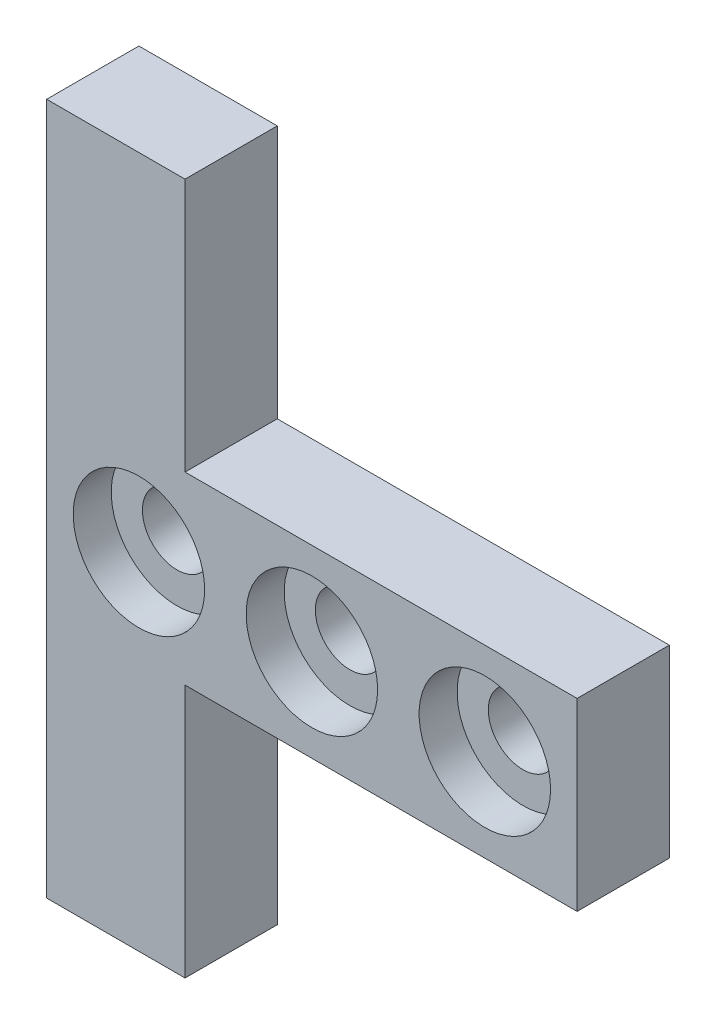
ISO-10303-21;
HEADER;
FILE_DESCRIPTION(('STEP AP214'),'2;1');
FILE_NAME('part.step','',(''),(''),'','','');
FILE_SCHEMA(('AUTOMOTIVE_DESIGN { 1 0 10303 214 1 1 1 1 }'));
ENDSEC;
DATA;
#1=APPLICATION_CONTEXT('core data for automotive mechanical design processes');
#2=APPLICATION_PROTOCOL_DEFINITION('international standard','automotive_design',2000,#1);
#3=PRODUCT_CONTEXT('',#1,'mechanical');
#4=PRODUCT('Part','Part','',(#3));
#5=PRODUCT_RELATED_PRODUCT_CATEGORY('part','',(#4));
#6=PRODUCT_DEFINITION_FORMATION('','',#4);
#7=PRODUCT_DEFINITION_CONTEXT('part definition',#1,'design');
#8=PRODUCT_DEFINITION('design','',#6,#7);
#9=PRODUCT_DEFINITION_SHAPE('','',#8);
#10=(LENGTH_UNIT() NAMED_UNIT(*) SI_UNIT(.MILLI.,.METRE.));
#11=(NAMED_UNIT(*) PLANE_ANGLE_UNIT() SI_UNIT($,.RADIAN.));
#12=(NAMED_UNIT(*) SI_UNIT($,.STERADIAN.) SOLID_ANGLE_UNIT());
#13=UNCERTAINTY_MEASURE_WITH_UNIT(LENGTH_MEASURE(1.E-05),#10,'distance_accuracy_value','');
#14=(GEOMETRIC_REPRESENTATION_CONTEXT(3) GLOBAL_UNCERTAINTY_ASSIGNED_CONTEXT((#13)) GLOBAL_UNIT_ASSIGNED_CONTEXT((#10,
#11,#12)) REPRESENTATION_CONTEXT('',''));
#15=CARTESIAN_POINT('',(0.,0.,0.));
#16=DIRECTION('',(0.,0.,1.));
#17=DIRECTION('',(1.,0.,0.));
#18=AXIS2_PLACEMENT_3D('',#15,#16,#17);
#19=CARTESIAN_POINT('',(49.9972172088586,-189.705431529691,4.));
#20=DIRECTION('',(0.,0.,-1.));
#21=DIRECTION('',(-1.,0.,0.));
#22=AXIS2_PLACEMENT_3D('',#19,#20,#21);
#23=CYLINDRICAL_SURFACE('',#22,1.5);
#24=CARTESIAN_POINT('',(49.9972172088586,-189.705431529691,0.));
#25=DIRECTION('',(0.,0.,1.));
#26=DIRECTION('',(1.,0.,0.));
#27=AXIS2_PLACEMENT_3D('',#24,#25,#26);
#28=CIRCLE('',#27,1.5);
#29=CARTESIAN_POINT('',(51.4972172088586,-189.705431529691,0.));
#30=VERTEX_POINT('',#29);
#31=EDGE_CURVE('E150',#30,#30,#28,.T.);
#32=ORIENTED_EDGE('',*,*,#31,.F.);
#33=EDGE_LOOP('',(#32));
#34=FACE_BOUND('',#33,.T.);
#35=CARTESIAN_POINT('',(49.9972172088586,-189.705431529691,2.35));
#36=DIRECTION('',(0.,0.,1.));
#37=DIRECTION('',(1.,0.,0.));
#38=AXIS2_PLACEMENT_3D('',#35,#36,#37);
#39=CIRCLE('',#38,1.5);
#40=CARTESIAN_POINT('',(51.4972172088586,-189.705431529691,2.35));
#41=VERTEX_POINT('',#40);
#42=EDGE_CURVE('E39',#41,#41,#39,.T.);
#43=ORIENTED_EDGE('',*,*,#42,.T.);
#44=EDGE_LOOP('',(#43));
#45=FACE_BOUND('',#44,.T.);
#46=ADVANCED_FACE('F35',(#34,#45),#23,.F.);
#47=CARTESIAN_POINT('',(42.4972172088586,-189.705431529691,4.));
#48=DIRECTION('',(0.,0.,-1.));
#49=DIRECTION('',(-1.,0.,0.));
#50=AXIS2_PLACEMENT_3D('',#47,#48,#49);
#51=CYLINDRICAL_SURFACE('',#50,1.5);
#52=CARTESIAN_POINT('',(42.4972172088586,-189.705431529691,0.));
#53=DIRECTION('',(0.,0.,1.));
#54=DIRECTION('',(1.,0.,0.));
#55=AXIS2_PLACEMENT_3D('',#52,#53,#54);
#56=CIRCLE('',#55,1.5);
#57=CARTESIAN_POINT('',(43.9972172088586,-189.705431529691,0.));
#58=VERTEX_POINT('',#57);
#59=EDGE_CURVE('E147',#58,#58,#56,.T.);
#60=ORIENTED_EDGE('',*,*,#59,.F.);
#61=EDGE_LOOP('',(#60));
#62=FACE_BOUND('',#61,.T.);
#63=CARTESIAN_POINT('',(42.4972172088586,-189.705431529691,2.35));
#64=DIRECTION('',(0.,0.,1.));
#65=DIRECTION('',(1.,0.,0.));
#66=AXIS2_PLACEMENT_3D('',#63,#64,#65);
#67=CIRCLE('',#66,1.5);
#68=CARTESIAN_POINT('',(43.9972172088586,-189.705431529691,2.35));
#69=VERTEX_POINT('',#68);
#70=EDGE_CURVE('E164',#69,#69,#67,.T.);
#71=ORIENTED_EDGE('',*,*,#70,.T.);
#72=EDGE_LOOP('',(#71));
#73=FACE_BOUND('',#72,.T.);
#74=ADVANCED_FACE('F256',(#62,#73),#51,.F.);
#75=CARTESIAN_POINT('',(57.4972172088586,-189.705431529691,4.));
#76=DIRECTION('',(0.,0.,-1.));
#77=DIRECTION('',(-1.,0.,0.));
#78=AXIS2_PLACEMENT_3D('',#75,#76,#77);
#79=CYLINDRICAL_SURFACE('',#78,1.5);
#80=CARTESIAN_POINT('',(57.4972172088586,-189.705431529691,0.));
#81=DIRECTION('',(0.,0.,1.));
#82=DIRECTION('',(1.,0.,0.));
#83=AXIS2_PLACEMENT_3D('',#80,#81,#82);
#84=CIRCLE('',#83,1.5);
#85=CARTESIAN_POINT('',(58.9972172088586,-189.705431529691,0.));
#86=VERTEX_POINT('',#85);
#87=EDGE_CURVE('E153',#86,#86,#84,.T.);
#88=ORIENTED_EDGE('',*,*,#87,.F.);
#89=EDGE_LOOP('',(#88));
#90=FACE_BOUND('',#89,.T.);
#91=CARTESIAN_POINT('',(57.4972172088586,-189.705431529691,2.35));
#92=DIRECTION('',(0.,0.,1.));
#93=DIRECTION('',(1.,0.,0.));
#94=AXIS2_PLACEMENT_3D('',#91,#92,#93);
#95=CIRCLE('',#94,1.5);
#96=CARTESIAN_POINT('',(58.9972172088586,-189.705431529691,2.35));
#97=VERTEX_POINT('',#96);
#98=EDGE_CURVE('E162',#97,#97,#95,.T.);
#99=ORIENTED_EDGE('',*,*,#98,.T.);
#100=EDGE_LOOP('',(#99));
#101=FACE_BOUND('',#100,.T.);
#102=ADVANCED_FACE('F262',(#90,#101),#79,.F.);
#103=CARTESIAN_POINT('',(3.43624076470357E-13,-185.705431529692,4.));
#104=DIRECTION('',(0.,1.,0.));
#105=DIRECTION('',(-1.,0.,0.));
#106=AXIS2_PLACEMENT_3D('',#103,#104,#105);
#107=PLANE('',#106);
#108=DIRECTION('',(1.,0.,0.));
#109=VECTOR('',#108,1.);
#110=CARTESIAN_POINT('',(3.43624076470357E-13,-185.705431529692,0.));
#111=LINE('',#110,#109);
#112=CARTESIAN_POINT('',(44.4972172088586,-185.705431529692,0.));
#113=VERTEX_POINT('',#112);
#114=CARTESIAN_POINT('',(61.4972172088586,-185.705431529691,0.));
#115=VERTEX_POINT('',#114);
#116=EDGE_CURVE('E52',#113,#115,#111,.T.);
#117=ORIENTED_EDGE('',*,*,#116,.F.);
#118=DIRECTION('',(0.,0.,-1.));
#119=VECTOR('',#118,1.);
#120=CARTESIAN_POINT('',(44.4972172088586,-185.705431529692,4.));
#121=LINE('',#120,#119);
#122=CARTESIAN_POINT('',(44.4972172088586,-185.705431529692,4.));
#123=VERTEX_POINT('',#122);
#124=EDGE_CURVE('E220',#123,#113,#121,.T.);
#125=ORIENTED_EDGE('',*,*,#124,.F.);
#126=DIRECTION('',(1.,0.,0.));
#127=VECTOR('',#126,1.);
#128=CARTESIAN_POINT('',(3.43624076470357E-13,-185.705431529692,4.));
#129=LINE('',#128,#127);
#130=CARTESIAN_POINT('',(61.4972172088586,-185.705431529691,4.));
#131=VERTEX_POINT('',#130);
#132=EDGE_CURVE('E156',#123,#131,#129,.T.);
#133=ORIENTED_EDGE('',*,*,#132,.T.);
#134=DIRECTION('',(0.,0.,-1.));
#135=VECTOR('',#134,1.);
#136=CARTESIAN_POINT('',(61.4972172088586,-185.705431529691,4.));
#137=LINE('',#136,#135);
#138=EDGE_CURVE('E134',#131,#115,#137,.T.);
#139=ORIENTED_EDGE('',*,*,#138,.T.);
#140=EDGE_LOOP('',(#117,#125,#133,#139));
#141=FACE_BOUND('',#140,.T.);
#142=ADVANCED_FACE('F37',(#141),#107,.T.);
#143=CARTESIAN_POINT('',(0.,-174.705431529691,4.));
#144=DIRECTION('',(0.,-1.,0.));
#145=DIRECTION('',(0.,0.,-1.));
#146=AXIS2_PLACEMENT_3D('',#143,#144,#145);
#147=PLANE('',#146);
#148=DIRECTION('',(-1.,0.,0.));
#149=VECTOR('',#148,1.);
#150=CARTESIAN_POINT('',(0.,-174.705431529691,4.));
#151=LINE('',#150,#149);
#152=CARTESIAN_POINT('',(44.4972172088586,-174.705431529691,4.));
#153=VERTEX_POINT('',#152);
#154=CARTESIAN_POINT('',(38.4972172088586,-174.705431529691,4.));
#155=VERTEX_POINT('',#154);
#156=EDGE_CURVE('E129',#153,#155,#151,.T.);
#157=ORIENTED_EDGE('',*,*,#156,.F.);
#158=DIRECTION('',(0.,0.,1.));
#159=VECTOR('',#158,1.);
#160=CARTESIAN_POINT('',(44.4972172088586,-174.705431529691,4.));
#161=LINE('',#160,#159);
#162=CARTESIAN_POINT('',(44.4972172088586,-174.705431529691,0.));
#163=VERTEX_POINT('',#162);
#164=EDGE_CURVE('E109',#163,#153,#161,.T.);
#165=ORIENTED_EDGE('',*,*,#164,.F.);
#166=DIRECTION('',(-1.,0.,0.));
#167=VECTOR('',#166,1.);
#168=CARTESIAN_POINT('',(0.,-174.705431529691,0.));
#169=LINE('',#168,#167);
#170=CARTESIAN_POINT('',(38.4972172088586,-174.705431529691,0.));
#171=VERTEX_POINT('',#170);
#172=EDGE_CURVE('E136',#163,#171,#169,.T.);
#173=ORIENTED_EDGE('',*,*,#172,.T.);
#174=DIRECTION('',(0.,0.,-1.));
#175=VECTOR('',#174,1.);
#176=CARTESIAN_POINT('',(38.4972172088586,-174.705431529691,4.));
#177=LINE('',#176,#175);
#178=EDGE_CURVE('E11',#155,#171,#177,.T.);
#179=ORIENTED_EDGE('',*,*,#178,.F.);
#180=EDGE_LOOP('',(#157,#165,#173,#179));
#181=FACE_BOUND('',#180,.T.);
#182=ADVANCED_FACE('F206',(#181),#147,.F.);
#183=CARTESIAN_POINT('',(38.4972172088584,0.,4.));
#184=DIRECTION('',(1.,0.,0.));
#185=DIRECTION('',(0.,1.,0.));
#186=AXIS2_PLACEMENT_3D('',#183,#184,#185);
#187=PLANE('',#186);
#188=DIRECTION('',(0.,-1.,0.));
#189=VECTOR('',#188,1.);
#190=CARTESIAN_POINT('',(38.4972172088584,0.,0.));
#191=LINE('',#190,#189);
#192=CARTESIAN_POINT('',(38.4972172088586,-204.705431529692,0.));
#193=VERTEX_POINT('',#192);
#194=EDGE_CURVE('E138',#171,#193,#191,.T.);
#195=ORIENTED_EDGE('',*,*,#194,.T.);
#196=DIRECTION('',(0.,0.,-1.));
#197=VECTOR('',#196,1.);
#198=CARTESIAN_POINT('',(38.4972172088586,-204.705431529692,4.));
#199=LINE('',#198,#197);
#200=CARTESIAN_POINT('',(38.4972172088586,-204.705431529692,4.));
#201=VERTEX_POINT('',#200);
#202=EDGE_CURVE('E44',#201,#193,#199,.T.);
#203=ORIENTED_EDGE('',*,*,#202,.F.);
#204=DIRECTION('',(0.,-1.,0.));
#205=VECTOR('',#204,1.);
#206=CARTESIAN_POINT('',(38.4972172088584,0.,4.));
#207=LINE('',#206,#205);
#208=EDGE_CURVE('E123',#155,#201,#207,.T.);
#209=ORIENTED_EDGE('',*,*,#208,.F.);
#210=ORIENTED_EDGE('',*,*,#178,.T.);
#211=EDGE_LOOP('',(#195,#203,#209,#210));
#212=FACE_BOUND('',#211,.T.);
#213=ADVANCED_FACE('F210',(#212),#187,.F.);
#214=CARTESIAN_POINT('',(0.,-204.705431529692,4.));
#215=DIRECTION('',(0.,-1.,0.));
#216=DIRECTION('',(0.,0.,-1.));
#217=AXIS2_PLACEMENT_3D('',#214,#215,#216);
#218=PLANE('',#217);
#219=DIRECTION('',(0.,0.,-1.));
#220=VECTOR('',#219,1.);
#221=CARTESIAN_POINT('',(44.4972172088586,-204.705431529692,4.));
#222=LINE('',#221,#220);
#223=CARTESIAN_POINT('',(44.4972172088586,-204.705431529692,4.));
#224=VERTEX_POINT('',#223);
#225=CARTESIAN_POINT('',(44.4972172088586,-204.705431529692,0.));
#226=VERTEX_POINT('',#225);
#227=EDGE_CURVE('E60',#224,#226,#222,.T.);
#228=ORIENTED_EDGE('',*,*,#227,.F.);
#229=DIRECTION('',(-1.,0.,0.));
#230=VECTOR('',#229,1.);
#231=CARTESIAN_POINT('',(0.,-204.705431529692,4.));
#232=LINE('',#231,#230);
#233=EDGE_CURVE('E115',#224,#201,#232,.T.);
#234=ORIENTED_EDGE('',*,*,#233,.T.);
#235=ORIENTED_EDGE('',*,*,#202,.T.);
#236=DIRECTION('',(-1.,0.,0.));
#237=VECTOR('',#236,1.);
#238=CARTESIAN_POINT('',(0.,-204.705431529692,0.));
#239=LINE('',#238,#237);
#240=EDGE_CURVE('E117',#226,#193,#239,.T.);
#241=ORIENTED_EDGE('',*,*,#240,.F.);
#242=EDGE_LOOP('',(#228,#234,#235,#241));
#243=FACE_BOUND('',#242,.T.);
#244=ADVANCED_FACE('F113',(#243),#218,.T.);
#245=CARTESIAN_POINT('',(-3.58427050132025E-13,-193.705431529691,4.));
#246=DIRECTION('',(0.,1.,0.));
#247=DIRECTION('',(-1.,0.,0.));
#248=AXIS2_PLACEMENT_3D('',#245,#246,#247);
#249=PLANE('',#248);
#250=DIRECTION('',(1.,0.,0.));
#251=VECTOR('',#250,1.);
#252=CARTESIAN_POINT('',(-3.58427050132025E-13,-193.705431529691,0.));
#253=LINE('',#252,#251);
#254=CARTESIAN_POINT('',(44.4972172088586,-193.705431529691,0.));
#255=VERTEX_POINT('',#254);
#256=CARTESIAN_POINT('',(61.4972172088586,-193.705431529692,0.));
#257=VERTEX_POINT('',#256);
#258=EDGE_CURVE('E142',#255,#257,#253,.T.);
#259=ORIENTED_EDGE('',*,*,#258,.T.);
#260=DIRECTION('',(0.,0.,-1.));
#261=VECTOR('',#260,1.);
#262=CARTESIAN_POINT('',(61.4972172088586,-193.705431529692,4.));
#263=LINE('',#262,#261);
#264=CARTESIAN_POINT('',(61.4972172088586,-193.705431529692,4.));
#265=VERTEX_POINT('',#264);
#266=EDGE_CURVE('E158',#265,#257,#263,.T.);
#267=ORIENTED_EDGE('',*,*,#266,.F.);
#268=DIRECTION('',(1.,0.,0.));
#269=VECTOR('',#268,1.);
#270=CARTESIAN_POINT('',(-3.58427050132025E-13,-193.705431529691,4.));
#271=LINE('',#270,#269);
#272=CARTESIAN_POINT('',(44.4972172088586,-193.705431529691,4.));
#273=VERTEX_POINT('',#272);
#274=EDGE_CURVE('E125',#273,#265,#271,.T.);
#275=ORIENTED_EDGE('',*,*,#274,.F.);
#276=DIRECTION('',(0.,0.,1.));
#277=VECTOR('',#276,1.);
#278=CARTESIAN_POINT('',(44.4972172088586,-193.705431529691,4.));
#279=LINE('',#278,#277);
#280=EDGE_CURVE('E106',#255,#273,#279,.T.);
#281=ORIENTED_EDGE('',*,*,#280,.F.);
#282=EDGE_LOOP('',(#259,#267,#275,#281));
#283=FACE_BOUND('',#282,.T.);
#284=ADVANCED_FACE('F270',(#283),#249,.F.);
#285=CARTESIAN_POINT('',(61.4972172088586,0.,4.));
#286=DIRECTION('',(-1.,0.,0.));
#287=DIRECTION('',(0.,0.,1.));
#288=AXIS2_PLACEMENT_3D('',#285,#286,#287);
#289=PLANE('',#288);
#290=DIRECTION('',(0.,1.,0.));
#291=VECTOR('',#290,1.);
#292=CARTESIAN_POINT('',(61.4972172088586,0.,0.));
#293=LINE('',#292,#291);
#294=EDGE_CURVE('E144',#257,#115,#293,.T.);
#295=ORIENTED_EDGE('',*,*,#294,.T.);
#296=ORIENTED_EDGE('',*,*,#138,.F.);
#297=DIRECTION('',(0.,1.,0.));
#298=VECTOR('',#297,1.);
#299=CARTESIAN_POINT('',(61.4972172088586,0.,4.));
#300=LINE('',#299,#298);
#301=EDGE_CURVE('E127',#265,#131,#300,.T.);
#302=ORIENTED_EDGE('',*,*,#301,.F.);
#303=ORIENTED_EDGE('',*,*,#266,.T.);
#304=EDGE_LOOP('',(#295,#296,#302,#303));
#305=FACE_BOUND('',#304,.T.);
#306=ADVANCED_FACE('F235',(#305),#289,.F.);
#307=CARTESIAN_POINT('',(0.,0.,4.));
#308=DIRECTION('',(0.,0.,1.));
#309=DIRECTION('',(1.,0.,0.));
#310=AXIS2_PLACEMENT_3D('',#307,#308,#309);
#311=PLANE('',#310);
#312=DIRECTION('',(0.,-1.,0.));
#313=VECTOR('',#312,1.);
#314=CARTESIAN_POINT('',(44.4972172088586,-204.705431529692,4.));
#315=LINE('',#314,#313);
#316=EDGE_CURVE('E103',#273,#224,#315,.T.);
#317=ORIENTED_EDGE('',*,*,#316,.F.);
#318=ORIENTED_EDGE('',*,*,#274,.T.);
#319=ORIENTED_EDGE('',*,*,#301,.T.);
#320=ORIENTED_EDGE('',*,*,#132,.F.);
#321=DIRECTION('',(0.,-1.,0.));
#322=VECTOR('',#321,1.);
#323=CARTESIAN_POINT('',(44.4972172088586,-185.705431529692,4.));
#324=LINE('',#323,#322);
#325=EDGE_CURVE('E203',#153,#123,#324,.T.);
#326=ORIENTED_EDGE('',*,*,#325,.F.);
#327=ORIENTED_EDGE('',*,*,#156,.T.);
#328=ORIENTED_EDGE('',*,*,#208,.T.);
#329=ORIENTED_EDGE('',*,*,#233,.F.);
#330=EDGE_LOOP('',(#317,#318,#319,#320,#326,#327,#328,#329));
#331=FACE_BOUND('',#330,.T.);
#332=CARTESIAN_POINT('',(42.4972172088586,-189.705431529691,4.));
#333=DIRECTION('',(0.,0.,1.));
#334=DIRECTION('',(1.,0.,0.));
#335=AXIS2_PLACEMENT_3D('',#332,#333,#334);
#336=CIRCLE('',#335,2.85);
#337=CARTESIAN_POINT('',(45.3472172088586,-189.705431529691,4.));
#338=VERTEX_POINT('',#337);
#339=EDGE_CURVE('E183',#338,#338,#336,.T.);
#340=ORIENTED_EDGE('',*,*,#339,.F.);
#341=EDGE_LOOP('',(#340));
#342=FACE_BOUND('',#341,.T.);
#343=CARTESIAN_POINT('',(49.9972172088586,-189.705431529691,4.));
#344=DIRECTION('',(0.,0.,1.));
#345=DIRECTION('',(1.,0.,0.));
#346=AXIS2_PLACEMENT_3D('',#343,#344,#345);
#347=CIRCLE('',#346,2.85);
#348=CARTESIAN_POINT('',(52.8472172088586,-189.705431529691,4.));
#349=VERTEX_POINT('',#348);
#350=EDGE_CURVE('E184',#349,#349,#347,.T.);
#351=ORIENTED_EDGE('',*,*,#350,.F.);
#352=EDGE_LOOP('',(#351));
#353=FACE_BOUND('',#352,.T.);
#354=CARTESIAN_POINT('',(57.4972172088586,-189.705431529691,4.));
#355=DIRECTION('',(0.,0.,1.));
#356=DIRECTION('',(1.,0.,0.));
#357=AXIS2_PLACEMENT_3D('',#354,#355,#356);
#358=CIRCLE('',#357,2.85);
#359=CARTESIAN_POINT('',(60.3472172088586,-189.705431529691,4.));
#360=VERTEX_POINT('',#359);
#361=EDGE_CURVE('E195',#360,#360,#358,.T.);
#362=ORIENTED_EDGE('',*,*,#361,.F.);
#363=EDGE_LOOP('',(#362));
#364=FACE_BOUND('',#363,.T.);
#365=ADVANCED_FACE('F120',(#331,#342,#353,#364),#311,.T.);
#366=CARTESIAN_POINT('',(0.,0.,0.));
#367=DIRECTION('',(0.,0.,1.));
#368=DIRECTION('',(1.,0.,0.));
#369=AXIS2_PLACEMENT_3D('',#366,#367,#368);
#370=PLANE('',#369);
#371=ORIENTED_EDGE('',*,*,#258,.F.);
#372=DIRECTION('',(0.,1.,0.));
#373=VECTOR('',#372,1.);
#374=CARTESIAN_POINT('',(44.4972172088586,-204.705431529692,0.));
#375=LINE('',#374,#373);
#376=EDGE_CURVE('E118',#226,#255,#375,.T.);
#377=ORIENTED_EDGE('',*,*,#376,.F.);
#378=ORIENTED_EDGE('',*,*,#240,.T.);
#379=ORIENTED_EDGE('',*,*,#194,.F.);
#380=ORIENTED_EDGE('',*,*,#172,.F.);
#381=DIRECTION('',(0.,1.,0.));
#382=VECTOR('',#381,1.);
#383=CARTESIAN_POINT('',(44.4972172088586,-185.705431529692,0.));
#384=LINE('',#383,#382);
#385=EDGE_CURVE('E222',#113,#163,#384,.T.);
#386=ORIENTED_EDGE('',*,*,#385,.F.);
#387=ORIENTED_EDGE('',*,*,#116,.T.);
#388=ORIENTED_EDGE('',*,*,#294,.F.);
#389=EDGE_LOOP('',(#371,#377,#378,#379,#380,#386,#387,#388));
#390=FACE_BOUND('',#389,.T.);
#391=ORIENTED_EDGE('',*,*,#59,.T.);
#392=EDGE_LOOP('',(#391));
#393=FACE_BOUND('',#392,.T.);
#394=ORIENTED_EDGE('',*,*,#31,.T.);
#395=EDGE_LOOP('',(#394));
#396=FACE_BOUND('',#395,.T.);
#397=ORIENTED_EDGE('',*,*,#87,.T.);
#398=EDGE_LOOP('',(#397));
#399=FACE_BOUND('',#398,.T.);
#400=ADVANCED_FACE('F212',(#390,#393,#396,#399),#370,.F.);
#401=CARTESIAN_POINT('',(57.4972172088586,-189.705431529691,2.35));
#402=DIRECTION('',(0.,0.,1.));
#403=DIRECTION('',(1.,0.,0.));
#404=AXIS2_PLACEMENT_3D('',#401,#402,#403);
#405=CYLINDRICAL_SURFACE('',#404,2.85);
#406=CARTESIAN_POINT('',(57.4972172088586,-189.705431529691,2.35));
#407=DIRECTION('',(0.,0.,1.));
#408=DIRECTION('',(1.,0.,0.));
#409=AXIS2_PLACEMENT_3D('',#406,#407,#408);
#410=CIRCLE('',#409,2.85);
#411=CARTESIAN_POINT('',(60.3472172088586,-189.705431529691,2.35));
#412=VERTEX_POINT('',#411);
#413=EDGE_CURVE('E189',#412,#412,#410,.T.);
#414=ORIENTED_EDGE('',*,*,#413,.F.);
#415=EDGE_LOOP('',(#414));
#416=FACE_BOUND('',#415,.T.);
#417=ORIENTED_EDGE('',*,*,#361,.T.);
#418=EDGE_LOOP('',(#417));
#419=FACE_BOUND('',#418,.T.);
#420=ADVANCED_FACE('F241',(#416,#419),#405,.F.);
#421=CARTESIAN_POINT('',(57.4972172088586,-189.705431529691,2.35));
#422=DIRECTION('',(0.,0.,1.));
#423=DIRECTION('',(1.,0.,0.));
#424=AXIS2_PLACEMENT_3D('',#421,#422,#423);
#425=PLANE('',#424);
#426=ORIENTED_EDGE('',*,*,#98,.F.);
#427=EDGE_LOOP('',(#426));
#428=FACE_BOUND('',#427,.T.);
#429=ORIENTED_EDGE('',*,*,#413,.T.);
#430=EDGE_LOOP('',(#429));
#431=FACE_BOUND('',#430,.T.);
#432=ADVANCED_FACE('F243',(#428,#431),#425,.T.);
#433=CARTESIAN_POINT('',(49.9972172088586,-189.705431529691,2.35));
#434=DIRECTION('',(0.,0.,1.));
#435=DIRECTION('',(1.,0.,0.));
#436=AXIS2_PLACEMENT_3D('',#433,#434,#435);
#437=CYLINDRICAL_SURFACE('',#436,2.85);
#438=CARTESIAN_POINT('',(49.9972172088586,-189.705431529691,2.35));
#439=DIRECTION('',(0.,0.,1.));
#440=DIRECTION('',(1.,0.,0.));
#441=AXIS2_PLACEMENT_3D('',#438,#439,#440);
#442=CIRCLE('',#441,2.85);
#443=CARTESIAN_POINT('',(52.8472172088586,-189.705431529691,2.35));
#444=VERTEX_POINT('',#443);
#445=EDGE_CURVE('E181',#444,#444,#442,.T.);
#446=ORIENTED_EDGE('',*,*,#445,.F.);
#447=EDGE_LOOP('',(#446));
#448=FACE_BOUND('',#447,.T.);
#449=ORIENTED_EDGE('',*,*,#350,.T.);
#450=EDGE_LOOP('',(#449));
#451=FACE_BOUND('',#450,.T.);
#452=ADVANCED_FACE('F177',(#448,#451),#437,.F.);
#453=CARTESIAN_POINT('',(49.9972172088586,-189.705431529691,2.35));
#454=DIRECTION('',(0.,0.,1.));
#455=DIRECTION('',(1.,0.,0.));
#456=AXIS2_PLACEMENT_3D('',#453,#454,#455);
#457=PLANE('',#456);
#458=ORIENTED_EDGE('',*,*,#42,.F.);
#459=EDGE_LOOP('',(#458));
#460=FACE_BOUND('',#459,.T.);
#461=ORIENTED_EDGE('',*,*,#445,.T.);
#462=EDGE_LOOP('',(#461));
#463=FACE_BOUND('',#462,.T.);
#464=ADVANCED_FACE('F173',(#460,#463),#457,.T.);
#465=CARTESIAN_POINT('',(42.4972172088586,-189.705431529691,2.35));
#466=DIRECTION('',(0.,0.,1.));
#467=DIRECTION('',(1.,0.,0.));
#468=AXIS2_PLACEMENT_3D('',#465,#466,#467);
#469=CYLINDRICAL_SURFACE('',#468,2.85);
#470=CARTESIAN_POINT('',(42.4972172088586,-189.705431529691,2.35));
#471=DIRECTION('',(0.,0.,1.));
#472=DIRECTION('',(1.,0.,0.));
#473=AXIS2_PLACEMENT_3D('',#470,#471,#472);
#474=CIRCLE('',#473,2.85);
#475=CARTESIAN_POINT('',(45.3472172088586,-189.705431529691,2.35));
#476=VERTEX_POINT('',#475);
#477=EDGE_CURVE('E165',#476,#476,#474,.T.);
#478=ORIENTED_EDGE('',*,*,#477,.F.);
#479=EDGE_LOOP('',(#478));
#480=FACE_BOUND('',#479,.T.);
#481=ORIENTED_EDGE('',*,*,#339,.T.);
#482=EDGE_LOOP('',(#481));
#483=FACE_BOUND('',#482,.T.);
#484=ADVANCED_FACE('F176',(#480,#483),#469,.F.);
#485=CARTESIAN_POINT('',(42.4972172088586,-189.705431529691,2.35));
#486=DIRECTION('',(0.,0.,1.));
#487=DIRECTION('',(1.,0.,0.));
#488=AXIS2_PLACEMENT_3D('',#485,#486,#487);
#489=PLANE('',#488);
#490=ORIENTED_EDGE('',*,*,#70,.F.);
#491=EDGE_LOOP('',(#490));
#492=FACE_BOUND('',#491,.T.);
#493=ORIENTED_EDGE('',*,*,#477,.T.);
#494=EDGE_LOOP('',(#493));
#495=FACE_BOUND('',#494,.T.);
#496=ADVANCED_FACE('F227',(#492,#495),#489,.T.);
#497=CARTESIAN_POINT('',(44.4972172088586,0.,0.));
#498=DIRECTION('',(-1.,0.,0.));
#499=DIRECTION('',(0.,0.,1.));
#500=AXIS2_PLACEMENT_3D('',#497,#498,#499);
#501=PLANE('',#500);
#502=ORIENTED_EDGE('',*,*,#325,.T.);
#503=ORIENTED_EDGE('',*,*,#124,.T.);
#504=ORIENTED_EDGE('',*,*,#385,.T.);
#505=ORIENTED_EDGE('',*,*,#164,.T.);
#506=EDGE_LOOP('',(#502,#503,#504,#505));
#507=FACE_BOUND('',#506,.T.);
#508=ADVANCED_FACE('F335',(#507),#501,.F.);
#509=CARTESIAN_POINT('',(44.4972172088586,0.,0.));
#510=DIRECTION('',(-1.,0.,0.));
#511=DIRECTION('',(0.,0.,1.));
#512=AXIS2_PLACEMENT_3D('',#509,#510,#511);
#513=PLANE('',#512);
#514=ORIENTED_EDGE('',*,*,#316,.T.);
#515=ORIENTED_EDGE('',*,*,#227,.T.);
#516=ORIENTED_EDGE('',*,*,#376,.T.);
#517=ORIENTED_EDGE('',*,*,#280,.T.);
#518=EDGE_LOOP('',(#514,#515,#516,#517));
#519=FACE_BOUND('',#518,.T.);
#520=ADVANCED_FACE('F104',(#519),#513,.F.);
#521=CLOSED_SHELL('',(#46,#74,#102,#142,#182,#213,#244,#284,#306,#365,#400,#420,#432,#452,#464,
#484,#496,#508,#520));
#522=MANIFOLD_SOLID_BREP('B2',#521);
#523=ADVANCED_BREP_SHAPE_REPRESENTATION('',(#18,#522),#14);
#524=SHAPE_DEFINITION_REPRESENTATION(#9,#523);
ENDSEC;
END-ISO-10303-21;
